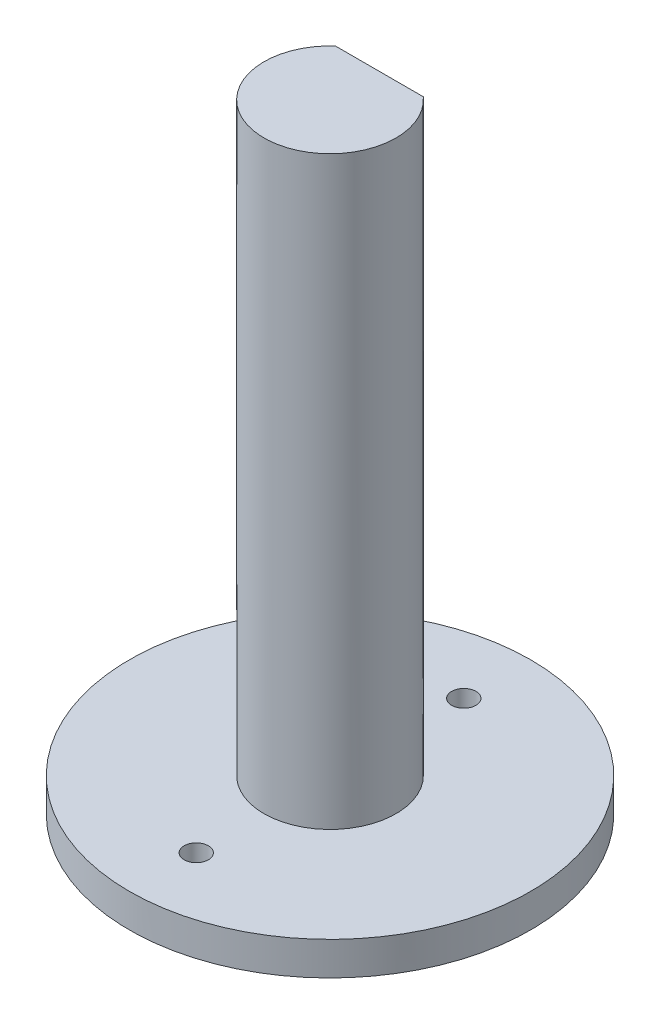
ISO-10303-21;
HEADER;
FILE_DESCRIPTION(('STEP AP214'),'2;1');
FILE_NAME('part.step','',(''),(''),'','','');
FILE_SCHEMA(('AUTOMOTIVE_DESIGN { 1 0 10303 214 1 1 1 1 }'));
ENDSEC;
DATA;
#1=APPLICATION_CONTEXT('core data for automotive mechanical design processes');
#2=APPLICATION_PROTOCOL_DEFINITION('international standard','automotive_design',2000,#1);
#3=PRODUCT_CONTEXT('',#1,'mechanical');
#4=PRODUCT('Part','Part','',(#3));
#5=PRODUCT_RELATED_PRODUCT_CATEGORY('part','',(#4));
#6=PRODUCT_DEFINITION_FORMATION('','',#4);
#7=PRODUCT_DEFINITION_CONTEXT('part definition',#1,'design');
#8=PRODUCT_DEFINITION('design','',#6,#7);
#9=PRODUCT_DEFINITION_SHAPE('','',#8);
#10=(LENGTH_UNIT() NAMED_UNIT(*) SI_UNIT(.MILLI.,.METRE.));
#11=(NAMED_UNIT(*) PLANE_ANGLE_UNIT() SI_UNIT($,.RADIAN.));
#12=(NAMED_UNIT(*) SI_UNIT($,.STERADIAN.) SOLID_ANGLE_UNIT());
#13=UNCERTAINTY_MEASURE_WITH_UNIT(LENGTH_MEASURE(1.E-05),#10,'distance_accuracy_value','');
#14=(GEOMETRIC_REPRESENTATION_CONTEXT(3) GLOBAL_UNCERTAINTY_ASSIGNED_CONTEXT((#13)) GLOBAL_UNIT_ASSIGNED_CONTEXT((#10,
#11,#12)) REPRESENTATION_CONTEXT('',''));
#15=CARTESIAN_POINT('',(0.,0.,0.));
#16=DIRECTION('',(0.,0.,1.));
#17=DIRECTION('',(1.,0.,0.));
#18=AXIS2_PLACEMENT_3D('',#15,#16,#17);
#19=CARTESIAN_POINT('',(0.,4.,0.));
#20=DIRECTION('',(0.,-1.,0.));
#21=DIRECTION('',(0.,0.,-1.));
#22=AXIS2_PLACEMENT_3D('',#19,#20,#21);
#23=CYLINDRICAL_SURFACE('',#22,12.);
#24=CARTESIAN_POINT('',(0.,4.,0.));
#25=DIRECTION('',(0.,1.,0.));
#26=DIRECTION('',(0.,0.,1.));
#27=AXIS2_PLACEMENT_3D('',#24,#25,#26);
#28=CIRCLE('',#27,12.);
#29=CARTESIAN_POINT('',(0.,4.,12.));
#30=VERTEX_POINT('',#29);
#31=EDGE_CURVE('E54',#30,#30,#28,.T.);
#32=ORIENTED_EDGE('',*,*,#31,.F.);
#33=EDGE_LOOP('',(#32));
#34=FACE_BOUND('',#33,.T.);
#35=CARTESIAN_POINT('',(0.,2.,0.));
#36=DIRECTION('',(0.,-1.,0.));
#37=DIRECTION('',(0.,0.,-1.));
#38=AXIS2_PLACEMENT_3D('',#35,#36,#37);
#39=CIRCLE('',#38,12.);
#40=CARTESIAN_POINT('',(0.,2.,-12.));
#41=VERTEX_POINT('',#40);
#42=EDGE_CURVE('E80',#41,#41,#39,.T.);
#43=ORIENTED_EDGE('',*,*,#42,.F.);
#44=EDGE_LOOP('',(#43));
#45=FACE_BOUND('',#44,.T.);
#46=ADVANCED_FACE('F45',(#34,#45),#23,.T.);
#47=CARTESIAN_POINT('',(0.,4.,0.));
#48=DIRECTION('',(0.,1.,0.));
#49=DIRECTION('',(0.,0.,1.));
#50=AXIS2_PLACEMENT_3D('',#47,#48,#49);
#51=PLANE('',#50);
#52=CARTESIAN_POINT('',(0.,4.,8.));
#53=DIRECTION('',(0.,1.,0.));
#54=DIRECTION('',(0.,0.,1.));
#55=AXIS2_PLACEMENT_3D('',#52,#53,#54);
#56=CIRCLE('',#55,0.726366889347744);
#57=CARTESIAN_POINT('',(0.,4.,8.72636688934774));
#58=VERTEX_POINT('',#57);
#59=EDGE_CURVE('E109',#58,#58,#56,.T.);
#60=ORIENTED_EDGE('',*,*,#59,.F.);
#61=EDGE_LOOP('',(#60));
#62=FACE_BOUND('',#61,.T.);
#63=CARTESIAN_POINT('',(0.,4.,-8.));
#64=DIRECTION('',(0.,1.,0.));
#65=DIRECTION('',(0.,0.,1.));
#66=AXIS2_PLACEMENT_3D('',#63,#64,#65);
#67=CIRCLE('',#66,0.726366889347744);
#68=CARTESIAN_POINT('',(0.,4.,-7.27363311065226));
#69=VERTEX_POINT('',#68);
#70=EDGE_CURVE('E99',#69,#69,#67,.T.);
#71=ORIENTED_EDGE('',*,*,#70,.F.);
#72=EDGE_LOOP('',(#71));
#73=FACE_BOUND('',#72,.T.);
#74=CARTESIAN_POINT('',(0.,4.,0.));
#75=DIRECTION('',(0.,1.,0.));
#76=DIRECTION('',(0.,0.,1.));
#77=AXIS2_PLACEMENT_3D('',#74,#75,#76);
#78=CIRCLE('',#77,3.95);
#79=CARTESIAN_POINT('',(0.,4.,3.95));
#80=VERTEX_POINT('',#79);
#81=EDGE_CURVE('E11',#80,#80,#78,.T.);
#82=ORIENTED_EDGE('',*,*,#81,.F.);
#83=EDGE_LOOP('',(#82));
#84=FACE_BOUND('',#83,.T.);
#85=ORIENTED_EDGE('',*,*,#31,.T.);
#86=EDGE_LOOP('',(#85));
#87=FACE_BOUND('',#86,.T.);
#88=ADVANCED_FACE('F136',(#62,#73,#84,#87),#51,.T.);
#89=CARTESIAN_POINT('',(0.,39.,0.));
#90=DIRECTION('',(0.,-1.,0.));
#91=DIRECTION('',(0.,0.,-1.));
#92=AXIS2_PLACEMENT_3D('',#89,#90,#91);
#93=CYLINDRICAL_SURFACE('',#92,3.95);
#94=CARTESIAN_POINT('',(0.,39.,0.));
#95=DIRECTION('',(0.,1.,0.));
#96=DIRECTION('',(0.,0.,1.));
#97=AXIS2_PLACEMENT_3D('',#94,#95,#96);
#98=CIRCLE('',#97,3.95);
#99=CARTESIAN_POINT('',(-2.62678510731274,39.,-2.95));
#100=VERTEX_POINT('',#99);
#101=CARTESIAN_POINT('',(2.62678510731274,39.,-2.95));
#102=VERTEX_POINT('',#101);
#103=EDGE_CURVE('E86',#100,#102,#98,.T.);
#104=ORIENTED_EDGE('',*,*,#103,.F.);
#105=DIRECTION('',(0.,1.,0.));
#106=VECTOR('',#105,1.);
#107=CARTESIAN_POINT('',(-2.62678510731274,19.,-2.95));
#108=LINE('',#107,#106);
#109=CARTESIAN_POINT('',(-2.62678510731274,19.,-2.95));
#110=VERTEX_POINT('',#109);
#111=EDGE_CURVE('E62',#110,#100,#108,.T.);
#112=ORIENTED_EDGE('',*,*,#111,.F.);
#113=CARTESIAN_POINT('',(0.,19.,0.));
#114=DIRECTION('',(0.,1.,0.));
#115=DIRECTION('',(0.,0.,1.));
#116=AXIS2_PLACEMENT_3D('',#113,#114,#115);
#117=CIRCLE('',#116,3.95);
#118=CARTESIAN_POINT('',(2.62678510731274,19.,-2.95));
#119=VERTEX_POINT('',#118);
#120=EDGE_CURVE('E79',#119,#110,#117,.T.);
#121=ORIENTED_EDGE('',*,*,#120,.F.);
#122=DIRECTION('',(0.,1.,0.));
#123=VECTOR('',#122,1.);
#124=CARTESIAN_POINT('',(2.62678510731274,19.,-2.95));
#125=LINE('',#124,#123);
#126=EDGE_CURVE('E68',#119,#102,#125,.T.);
#127=ORIENTED_EDGE('',*,*,#126,.T.);
#128=EDGE_LOOP('',(#104,#112,#121,#127));
#129=FACE_BOUND('',#128,.T.);
#130=ORIENTED_EDGE('',*,*,#81,.T.);
#131=EDGE_LOOP('',(#130));
#132=FACE_BOUND('',#131,.T.);
#133=ADVANCED_FACE('F84',(#129,#132),#93,.T.);
#134=CARTESIAN_POINT('',(0.,39.,0.));
#135=DIRECTION('',(0.,1.,0.));
#136=DIRECTION('',(0.,0.,1.));
#137=AXIS2_PLACEMENT_3D('',#134,#135,#136);
#138=PLANE('',#137);
#139=DIRECTION('',(1.,0.,0.));
#140=VECTOR('',#139,1.);
#141=CARTESIAN_POINT('',(2.62678510731274,39.,-2.95));
#142=LINE('',#141,#140);
#143=EDGE_CURVE('E73',#100,#102,#142,.T.);
#144=ORIENTED_EDGE('',*,*,#143,.F.);
#145=ORIENTED_EDGE('',*,*,#103,.T.);
#146=EDGE_LOOP('',(#144,#145));
#147=FACE_BOUND('',#146,.T.);
#148=ADVANCED_FACE('F89',(#147),#138,.T.);
#149=CARTESIAN_POINT('',(2.62678510731274,19.,-2.95));
#150=DIRECTION('',(0.,0.,1.));
#151=DIRECTION('',(1.,0.,0.));
#152=AXIS2_PLACEMENT_3D('',#149,#150,#151);
#153=PLANE('',#152);
#154=ORIENTED_EDGE('',*,*,#143,.T.);
#155=ORIENTED_EDGE('',*,*,#126,.F.);
#156=DIRECTION('',(1.,0.,0.));
#157=VECTOR('',#156,1.);
#158=CARTESIAN_POINT('',(2.62678510731274,19.,-2.95));
#159=LINE('',#158,#157);
#160=EDGE_CURVE('E119',#110,#119,#159,.T.);
#161=ORIENTED_EDGE('',*,*,#160,.F.);
#162=ORIENTED_EDGE('',*,*,#111,.T.);
#163=EDGE_LOOP('',(#154,#155,#161,#162));
#164=FACE_BOUND('',#163,.T.);
#165=ADVANCED_FACE('F74',(#164),#153,.F.);
#166=CARTESIAN_POINT('',(0.,19.,0.));
#167=DIRECTION('',(0.,1.,0.));
#168=DIRECTION('',(0.,0.,1.));
#169=AXIS2_PLACEMENT_3D('',#166,#167,#168);
#170=PLANE('',#169);
#171=ORIENTED_EDGE('',*,*,#120,.T.);
#172=ORIENTED_EDGE('',*,*,#160,.T.);
#173=EDGE_LOOP('',(#171,#172));
#174=FACE_BOUND('',#173,.T.);
#175=ADVANCED_FACE('F123',(#174),#170,.T.);
#176=CARTESIAN_POINT('',(0.,2.,0.));
#177=DIRECTION('',(0.,-1.,0.));
#178=DIRECTION('',(0.,0.,-1.));
#179=AXIS2_PLACEMENT_3D('',#176,#177,#178);
#180=PLANE('',#179);
#181=CARTESIAN_POINT('',(0.,2.,8.));
#182=DIRECTION('',(0.,-1.,0.));
#183=DIRECTION('',(0.,0.,-1.));
#184=AXIS2_PLACEMENT_3D('',#181,#182,#183);
#185=CIRCLE('',#184,0.726366889347744);
#186=CARTESIAN_POINT('',(0.,2.,7.27363311065226));
#187=VERTEX_POINT('',#186);
#188=EDGE_CURVE('E48',#187,#187,#185,.T.);
#189=ORIENTED_EDGE('',*,*,#188,.F.);
#190=EDGE_LOOP('',(#189));
#191=FACE_BOUND('',#190,.T.);
#192=CARTESIAN_POINT('',(0.,2.,-8.));
#193=DIRECTION('',(0.,-1.,0.));
#194=DIRECTION('',(0.,0.,-1.));
#195=AXIS2_PLACEMENT_3D('',#192,#193,#194);
#196=CIRCLE('',#195,0.726366889347744);
#197=CARTESIAN_POINT('',(0.,2.,-8.72636688934774));
#198=VERTEX_POINT('',#197);
#199=EDGE_CURVE('E96',#198,#198,#196,.T.);
#200=ORIENTED_EDGE('',*,*,#199,.F.);
#201=EDGE_LOOP('',(#200));
#202=FACE_BOUND('',#201,.T.);
#203=ORIENTED_EDGE('',*,*,#42,.T.);
#204=EDGE_LOOP('',(#203));
#205=FACE_BOUND('',#204,.T.);
#206=ADVANCED_FACE('F125',(#191,#202,#205),#180,.T.);
#207=CARTESIAN_POINT('',(0.,39.,-8.));
#208=DIRECTION('',(0.,-1.,0.));
#209=DIRECTION('',(0.,0.,-1.));
#210=AXIS2_PLACEMENT_3D('',#207,#208,#209);
#211=CYLINDRICAL_SURFACE('',#210,0.726366889347744);
#212=ORIENTED_EDGE('',*,*,#70,.T.);
#213=EDGE_LOOP('',(#212));
#214=FACE_BOUND('',#213,.T.);
#215=ORIENTED_EDGE('',*,*,#199,.T.);
#216=EDGE_LOOP('',(#215));
#217=FACE_BOUND('',#216,.T.);
#218=ADVANCED_FACE('F132',(#214,#217),#211,.F.);
#219=CARTESIAN_POINT('',(0.,39.,8.));
#220=DIRECTION('',(0.,-1.,0.));
#221=DIRECTION('',(0.,0.,-1.));
#222=AXIS2_PLACEMENT_3D('',#219,#220,#221);
#223=CYLINDRICAL_SURFACE('',#222,0.726366889347744);
#224=ORIENTED_EDGE('',*,*,#59,.T.);
#225=EDGE_LOOP('',(#224));
#226=FACE_BOUND('',#225,.T.);
#227=ORIENTED_EDGE('',*,*,#188,.T.);
#228=EDGE_LOOP('',(#227));
#229=FACE_BOUND('',#228,.T.);
#230=ADVANCED_FACE('F188',(#226,#229),#223,.F.);
#231=CLOSED_SHELL('',(#46,#88,#133,#148,#165,#175,#206,#218,#230));
#232=MANIFOLD_SOLID_BREP('B2',#231);
#233=ADVANCED_BREP_SHAPE_REPRESENTATION('',(#18,#232),#14);
#234=SHAPE_DEFINITION_REPRESENTATION(#9,#233);
ENDSEC;
END-ISO-10303-21;
